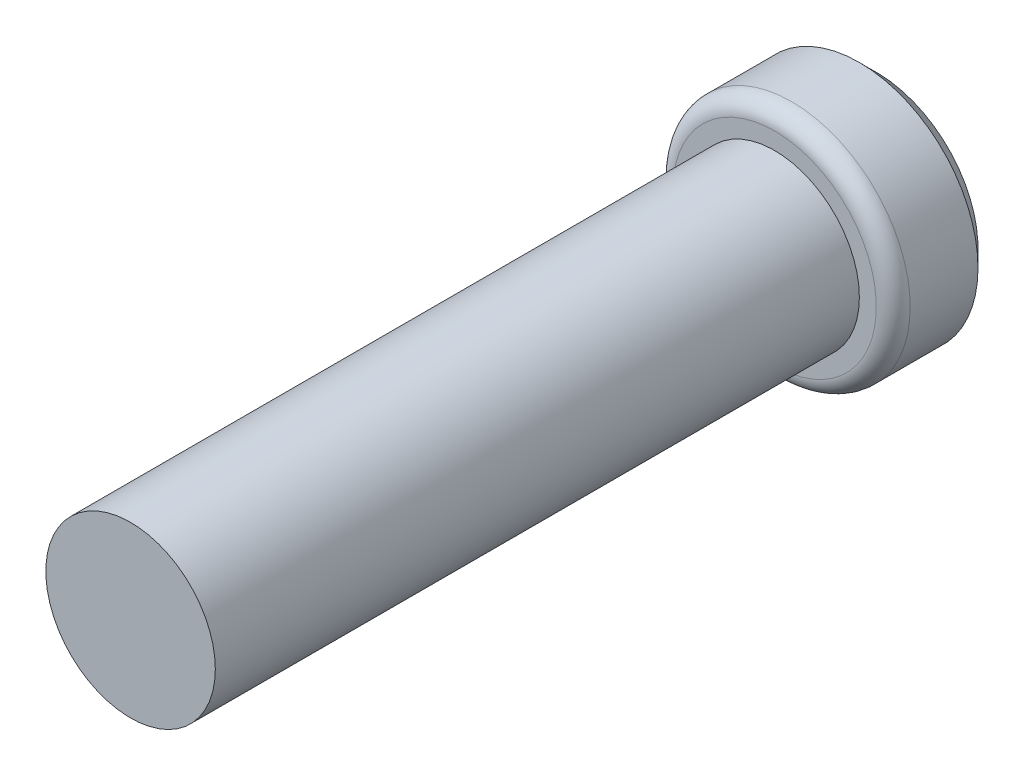
ISO-10303-21;
HEADER;
FILE_DESCRIPTION(('STEP AP214'),'2;1');
FILE_NAME('part.step','',(''),(''),'','','');
FILE_SCHEMA(('AUTOMOTIVE_DESIGN { 1 0 10303 214 1 1 1 1 }'));
ENDSEC;
DATA;
#1=APPLICATION_CONTEXT('core data for automotive mechanical design processes');
#2=APPLICATION_PROTOCOL_DEFINITION('international standard','automotive_design',2000,#1);
#3=PRODUCT_CONTEXT('',#1,'mechanical');
#4=PRODUCT('Part','Part','',(#3));
#5=PRODUCT_RELATED_PRODUCT_CATEGORY('part','',(#4));
#6=PRODUCT_DEFINITION_FORMATION('','',#4);
#7=PRODUCT_DEFINITION_CONTEXT('part definition',#1,'design');
#8=PRODUCT_DEFINITION('design','',#6,#7);
#9=PRODUCT_DEFINITION_SHAPE('','',#8);
#10=(LENGTH_UNIT() NAMED_UNIT(*) SI_UNIT(.MILLI.,.METRE.));
#11=(NAMED_UNIT(*) PLANE_ANGLE_UNIT() SI_UNIT($,.RADIAN.));
#12=(NAMED_UNIT(*) SI_UNIT($,.STERADIAN.) SOLID_ANGLE_UNIT());
#13=UNCERTAINTY_MEASURE_WITH_UNIT(LENGTH_MEASURE(1.E-05),#10,'distance_accuracy_value','');
#14=(GEOMETRIC_REPRESENTATION_CONTEXT(3) GLOBAL_UNCERTAINTY_ASSIGNED_CONTEXT((#13)) GLOBAL_UNIT_ASSIGNED_CONTEXT((#10,
#11,#12)) REPRESENTATION_CONTEXT('',''));
#15=CARTESIAN_POINT('',(0.,0.,0.));
#16=DIRECTION('',(0.,0.,1.));
#17=DIRECTION('',(1.,0.,0.));
#18=AXIS2_PLACEMENT_3D('',#15,#16,#17);
#19=CARTESIAN_POINT('',(0.,0.,19.));
#20=DIRECTION('',(0.,0.,-1.));
#21=DIRECTION('',(-1.,0.,0.));
#22=AXIS2_PLACEMENT_3D('',#19,#20,#21);
#23=CYLINDRICAL_SURFACE('',#22,2.5);
#24=CARTESIAN_POINT('',(0.,0.,19.));
#25=DIRECTION('',(0.,0.,1.));
#26=DIRECTION('',(1.,0.,0.));
#27=AXIS2_PLACEMENT_3D('',#24,#25,#26);
#28=CIRCLE('',#27,2.5);
#29=CARTESIAN_POINT('',(2.5,0.,19.));
#30=VERTEX_POINT('',#29);
#31=EDGE_CURVE('E144',#30,#30,#28,.T.);
#32=ORIENTED_EDGE('',*,*,#31,.F.);
#33=EDGE_LOOP('',(#32));
#34=FACE_BOUND('',#33,.T.);
#35=CARTESIAN_POINT('',(0.,0.,0.));
#36=DIRECTION('',(0.,0.,1.));
#37=DIRECTION('',(1.,0.,0.));
#38=AXIS2_PLACEMENT_3D('',#35,#36,#37);
#39=CIRCLE('',#38,2.5);
#40=CARTESIAN_POINT('',(2.5,0.,0.));
#41=VERTEX_POINT('',#40);
#42=EDGE_CURVE('E138',#41,#41,#39,.T.);
#43=ORIENTED_EDGE('',*,*,#42,.T.);
#44=EDGE_LOOP('',(#43));
#45=FACE_BOUND('',#44,.T.);
#46=ADVANCED_FACE('F36',(#34,#45),#23,.T.);
#47=CARTESIAN_POINT('',(0.,0.,19.));
#48=DIRECTION('',(0.,0.,1.));
#49=DIRECTION('',(1.,0.,0.));
#50=AXIS2_PLACEMENT_3D('',#47,#48,#49);
#51=PLANE('',#50);
#52=ORIENTED_EDGE('',*,*,#31,.T.);
#53=EDGE_LOOP('',(#52));
#54=FACE_BOUND('',#53,.T.);
#55=ADVANCED_FACE('F169',(#54),#51,.T.);
#56=CARTESIAN_POINT('',(0.,0.,-3.));
#57=DIRECTION('',(0.,0.,1.));
#58=DIRECTION('',(1.,0.,0.));
#59=AXIS2_PLACEMENT_3D('',#56,#57,#58);
#60=CYLINDRICAL_SURFACE('',#59,3.5);
#61=CARTESIAN_POINT('',(0.,0.,-0.5));
#62=DIRECTION('',(0.,0.,-1.));
#63=DIRECTION('',(-1.,0.,0.));
#64=AXIS2_PLACEMENT_3D('',#61,#62,#63);
#65=CIRCLE('',#64,3.5);
#66=CARTESIAN_POINT('',(-3.5,0.,-0.5));
#67=VERTEX_POINT('',#66);
#68=EDGE_CURVE('E44',#67,#67,#65,.T.);
#69=ORIENTED_EDGE('',*,*,#68,.T.);
#70=EDGE_LOOP('',(#69));
#71=FACE_BOUND('',#70,.T.);
#72=CARTESIAN_POINT('',(0.,0.,-2.5));
#73=DIRECTION('',(0.,0.,-1.));
#74=DIRECTION('',(-1.,0.,0.));
#75=AXIS2_PLACEMENT_3D('',#72,#73,#74);
#76=CIRCLE('',#75,3.5);
#77=CARTESIAN_POINT('',(-3.5,0.,-2.5));
#78=VERTEX_POINT('',#77);
#79=EDGE_CURVE('E152',#78,#78,#76,.F.);
#80=ORIENTED_EDGE('',*,*,#79,.T.);
#81=EDGE_LOOP('',(#80));
#82=FACE_BOUND('',#81,.T.);
#83=ADVANCED_FACE('F157',(#71,#82),#60,.T.);
#84=CARTESIAN_POINT('',(0.,0.,-3.));
#85=DIRECTION('',(0.,0.,-1.));
#86=DIRECTION('',(-1.,0.,0.));
#87=AXIS2_PLACEMENT_3D('',#84,#85,#86);
#88=PLANE('',#87);
#89=CARTESIAN_POINT('',(0.,0.,-3.));
#90=DIRECTION('',(0.,0.,-1.));
#91=DIRECTION('',(-1.,0.,0.));
#92=AXIS2_PLACEMENT_3D('',#89,#90,#91);
#93=CIRCLE('',#92,3.);
#94=CARTESIAN_POINT('',(-3.,0.,-3.));
#95=VERTEX_POINT('',#94);
#96=EDGE_CURVE('E147',#95,#95,#93,.T.);
#97=ORIENTED_EDGE('',*,*,#96,.T.);
#98=EDGE_LOOP('',(#97));
#99=FACE_BOUND('',#98,.T.);
#100=DIRECTION('',(-0.866025403784436,0.500000000000004,0.));
#101=VECTOR('',#100,1.);
#102=CARTESIAN_POINT('',(-1.09002923180361,-1.8879860112191,-3.));
#103=LINE('',#102,#101);
#104=CARTESIAN_POINT('',(0.,-2.51731468162548,-3.));
#105=VERTEX_POINT('',#104);
#106=CARTESIAN_POINT('',(-2.18005846360722,-1.25865734081272,-3.));
#107=VERTEX_POINT('',#106);
#108=EDGE_CURVE('E51',#105,#107,#103,.T.);
#109=ORIENTED_EDGE('',*,*,#108,.F.);
#110=DIRECTION('',(-0.86602540378444,-0.499999999999998,0.));
#111=VECTOR('',#110,1.);
#112=CARTESIAN_POINT('',(1.0900292318036,-1.88798601121912,-3.));
#113=LINE('',#112,#111);
#114=CARTESIAN_POINT('',(2.1800584636072,-1.25865734081275,-3.));
#115=VERTEX_POINT('',#114);
#116=EDGE_CURVE('E134',#115,#105,#113,.T.);
#117=ORIENTED_EDGE('',*,*,#116,.F.);
#118=DIRECTION('',(0.,-1.,0.));
#119=VECTOR('',#118,1.);
#120=CARTESIAN_POINT('',(2.1800584636072,0.,-3.));
#121=LINE('',#120,#119);
#122=CARTESIAN_POINT('',(2.18005846360721,1.25865734081274,-3.));
#123=VERTEX_POINT('',#122);
#124=EDGE_CURVE('E132',#123,#115,#121,.T.);
#125=ORIENTED_EDGE('',*,*,#124,.F.);
#126=DIRECTION('',(0.866025403784438,-0.500000000000001,0.));
#127=VECTOR('',#126,1.);
#128=CARTESIAN_POINT('',(1.0900292318036,1.88798601121911,-3.));
#129=LINE('',#128,#127);
#130=CARTESIAN_POINT('',(0.,2.51731468162548,-3.));
#131=VERTEX_POINT('',#130);
#132=EDGE_CURVE('E99',#131,#123,#129,.T.);
#133=ORIENTED_EDGE('',*,*,#132,.F.);
#134=DIRECTION('',(0.866025403784441,0.499999999999995,0.));
#135=VECTOR('',#134,1.);
#136=CARTESIAN_POINT('',(-1.0900292318036,1.88798601121912,-3.));
#137=LINE('',#136,#135);
#138=CARTESIAN_POINT('',(-2.18005846360719,1.25865734081277,-3.));
#139=VERTEX_POINT('',#138);
#140=EDGE_CURVE('E128',#139,#131,#137,.T.);
#141=ORIENTED_EDGE('',*,*,#140,.F.);
#142=DIRECTION('',(0.,1.,0.));
#143=VECTOR('',#142,1.);
#144=CARTESIAN_POINT('',(-2.1800584636072,0.,-3.));
#145=LINE('',#144,#143);
#146=EDGE_CURVE('E125',#107,#139,#145,.T.);
#147=ORIENTED_EDGE('',*,*,#146,.F.);
#148=EDGE_LOOP('',(#109,#117,#125,#133,#141,#147));
#149=FACE_BOUND('',#148,.T.);
#150=ADVANCED_FACE('F185',(#99,#149),#88,.T.);
#151=CARTESIAN_POINT('',(0.,0.,0.));
#152=DIRECTION('',(0.,0.,-1.));
#153=DIRECTION('',(-1.,0.,0.));
#154=AXIS2_PLACEMENT_3D('',#151,#152,#153);
#155=PLANE('',#154);
#156=CARTESIAN_POINT('',(0.,0.,0.));
#157=DIRECTION('',(0.,0.,-1.));
#158=DIRECTION('',(-1.,0.,0.));
#159=AXIS2_PLACEMENT_3D('',#156,#157,#158);
#160=CIRCLE('',#159,3.);
#161=CARTESIAN_POINT('',(-3.,0.,0.));
#162=VERTEX_POINT('',#161);
#163=EDGE_CURVE('E11',#162,#162,#160,.F.);
#164=ORIENTED_EDGE('',*,*,#163,.T.);
#165=EDGE_LOOP('',(#164));
#166=FACE_BOUND('',#165,.T.);
#167=ORIENTED_EDGE('',*,*,#42,.F.);
#168=EDGE_LOOP('',(#167));
#169=FACE_BOUND('',#168,.T.);
#170=ADVANCED_FACE('F186',(#166,#169),#155,.F.);
#171=CARTESIAN_POINT('',(-1.09002923180361,-1.8879860112191,-1.));
#172=DIRECTION('',(-0.500000000000004,-0.866025403784436,0.));
#173=DIRECTION('',(0.866025403784436,-0.500000000000004,0.));
#174=AXIS2_PLACEMENT_3D('',#171,#172,#173);
#175=PLANE('',#174);
#176=ORIENTED_EDGE('',*,*,#108,.T.);
#177=DIRECTION('',(0.,0.,-1.));
#178=VECTOR('',#177,1.);
#179=CARTESIAN_POINT('',(-2.18005846360722,-1.25865734081272,-1.));
#180=LINE('',#179,#178);
#181=CARTESIAN_POINT('',(-2.18005846360722,-1.25865734081272,-1.));
#182=VERTEX_POINT('',#181);
#183=EDGE_CURVE('E81',#182,#107,#180,.T.);
#184=ORIENTED_EDGE('',*,*,#183,.F.);
#185=DIRECTION('',(-0.866025403784436,0.500000000000004,0.));
#186=VECTOR('',#185,1.);
#187=CARTESIAN_POINT('',(-1.09002923180361,-1.8879860112191,-1.));
#188=LINE('',#187,#186);
#189=CARTESIAN_POINT('',(0.,-2.51731468162548,-1.));
#190=VERTEX_POINT('',#189);
#191=EDGE_CURVE('E136',#190,#182,#188,.T.);
#192=ORIENTED_EDGE('',*,*,#191,.F.);
#193=DIRECTION('',(0.,0.,-1.));
#194=VECTOR('',#193,1.);
#195=CARTESIAN_POINT('',(0.,-2.51731468162548,-1.));
#196=LINE('',#195,#194);
#197=EDGE_CURVE('E59',#190,#105,#196,.T.);
#198=ORIENTED_EDGE('',*,*,#197,.T.);
#199=EDGE_LOOP('',(#176,#184,#192,#198));
#200=FACE_BOUND('',#199,.T.);
#201=ADVANCED_FACE('F189',(#200),#175,.F.);
#202=CARTESIAN_POINT('',(1.0900292318036,-1.88798601121912,-1.));
#203=DIRECTION('',(0.499999999999998,-0.86602540378444,0.));
#204=DIRECTION('',(0.86602540378444,0.499999999999998,0.));
#205=AXIS2_PLACEMENT_3D('',#202,#203,#204);
#206=PLANE('',#205);
#207=ORIENTED_EDGE('',*,*,#116,.T.);
#208=ORIENTED_EDGE('',*,*,#197,.F.);
#209=DIRECTION('',(-0.86602540378444,-0.499999999999998,0.));
#210=VECTOR('',#209,1.);
#211=CARTESIAN_POINT('',(1.0900292318036,-1.88798601121912,-1.));
#212=LINE('',#211,#210);
#213=CARTESIAN_POINT('',(2.1800584636072,-1.25865734081275,-1.));
#214=VERTEX_POINT('',#213);
#215=EDGE_CURVE('E111',#214,#190,#212,.T.);
#216=ORIENTED_EDGE('',*,*,#215,.F.);
#217=DIRECTION('',(0.,0.,-1.));
#218=VECTOR('',#217,1.);
#219=CARTESIAN_POINT('',(2.1800584636072,-1.25865734081275,-1.));
#220=LINE('',#219,#218);
#221=EDGE_CURVE('E103',#214,#115,#220,.T.);
#222=ORIENTED_EDGE('',*,*,#221,.T.);
#223=EDGE_LOOP('',(#207,#208,#216,#222));
#224=FACE_BOUND('',#223,.T.);
#225=ADVANCED_FACE('F196',(#224),#206,.F.);
#226=CARTESIAN_POINT('',(2.1800584636072,0.,-1.));
#227=DIRECTION('',(1.,0.,0.));
#228=DIRECTION('',(0.,1.,0.));
#229=AXIS2_PLACEMENT_3D('',#226,#227,#228);
#230=PLANE('',#229);
#231=ORIENTED_EDGE('',*,*,#124,.T.);
#232=ORIENTED_EDGE('',*,*,#221,.F.);
#233=DIRECTION('',(0.,-1.,0.));
#234=VECTOR('',#233,1.);
#235=CARTESIAN_POINT('',(2.1800584636072,0.,-1.));
#236=LINE('',#235,#234);
#237=CARTESIAN_POINT('',(2.18005846360721,1.25865734081274,-1.));
#238=VERTEX_POINT('',#237);
#239=EDGE_CURVE('E107',#238,#214,#236,.T.);
#240=ORIENTED_EDGE('',*,*,#239,.F.);
#241=DIRECTION('',(0.,0.,-1.));
#242=VECTOR('',#241,1.);
#243=CARTESIAN_POINT('',(2.18005846360721,1.25865734081274,-1.));
#244=LINE('',#243,#242);
#245=EDGE_CURVE('E92',#238,#123,#244,.T.);
#246=ORIENTED_EDGE('',*,*,#245,.T.);
#247=EDGE_LOOP('',(#231,#232,#240,#246));
#248=FACE_BOUND('',#247,.T.);
#249=ADVANCED_FACE('F108',(#248),#230,.F.);
#250=CARTESIAN_POINT('',(1.0900292318036,1.88798601121911,-1.));
#251=DIRECTION('',(0.500000000000001,0.866025403784438,0.));
#252=DIRECTION('',(-0.866025403784438,0.500000000000001,0.));
#253=AXIS2_PLACEMENT_3D('',#250,#251,#252);
#254=PLANE('',#253);
#255=ORIENTED_EDGE('',*,*,#132,.T.);
#256=ORIENTED_EDGE('',*,*,#245,.F.);
#257=DIRECTION('',(0.866025403784438,-0.500000000000001,0.));
#258=VECTOR('',#257,1.);
#259=CARTESIAN_POINT('',(1.0900292318036,1.88798601121911,-1.));
#260=LINE('',#259,#258);
#261=CARTESIAN_POINT('',(0.,2.51731468162548,-1.));
#262=VERTEX_POINT('',#261);
#263=EDGE_CURVE('E96',#262,#238,#260,.T.);
#264=ORIENTED_EDGE('',*,*,#263,.F.);
#265=DIRECTION('',(0.,0.,-1.));
#266=VECTOR('',#265,1.);
#267=CARTESIAN_POINT('',(0.,2.51731468162548,-1.));
#268=LINE('',#267,#266);
#269=EDGE_CURVE('E104',#262,#131,#268,.T.);
#270=ORIENTED_EDGE('',*,*,#269,.T.);
#271=EDGE_LOOP('',(#255,#256,#264,#270));
#272=FACE_BOUND('',#271,.T.);
#273=ADVANCED_FACE('F94',(#272),#254,.F.);
#274=CARTESIAN_POINT('',(-1.0900292318036,1.88798601121912,-1.));
#275=DIRECTION('',(-0.499999999999995,0.866025403784441,0.));
#276=DIRECTION('',(-0.866025403784442,-0.499999999999995,0.));
#277=AXIS2_PLACEMENT_3D('',#274,#275,#276);
#278=PLANE('',#277);
#279=ORIENTED_EDGE('',*,*,#140,.T.);
#280=ORIENTED_EDGE('',*,*,#269,.F.);
#281=DIRECTION('',(0.866025403784441,0.499999999999995,0.));
#282=VECTOR('',#281,1.);
#283=CARTESIAN_POINT('',(-1.0900292318036,1.88798601121912,-1.));
#284=LINE('',#283,#282);
#285=CARTESIAN_POINT('',(-2.18005846360719,1.25865734081277,-1.));
#286=VERTEX_POINT('',#285);
#287=EDGE_CURVE('E117',#286,#262,#284,.T.);
#288=ORIENTED_EDGE('',*,*,#287,.F.);
#289=DIRECTION('',(0.,0.,-1.));
#290=VECTOR('',#289,1.);
#291=CARTESIAN_POINT('',(-2.18005846360719,1.25865734081277,-1.));
#292=LINE('',#291,#290);
#293=EDGE_CURVE('E141',#286,#139,#292,.T.);
#294=ORIENTED_EDGE('',*,*,#293,.T.);
#295=EDGE_LOOP('',(#279,#280,#288,#294));
#296=FACE_BOUND('',#295,.T.);
#297=ADVANCED_FACE('F200',(#296),#278,.F.);
#298=CARTESIAN_POINT('',(-2.1800584636072,0.,-1.));
#299=DIRECTION('',(-1.,0.,0.));
#300=DIRECTION('',(0.,-1.,0.));
#301=AXIS2_PLACEMENT_3D('',#298,#299,#300);
#302=PLANE('',#301);
#303=ORIENTED_EDGE('',*,*,#146,.T.);
#304=ORIENTED_EDGE('',*,*,#293,.F.);
#305=DIRECTION('',(0.,1.,0.));
#306=VECTOR('',#305,1.);
#307=CARTESIAN_POINT('',(-2.1800584636072,0.,-1.));
#308=LINE('',#307,#306);
#309=EDGE_CURVE('E119',#182,#286,#308,.T.);
#310=ORIENTED_EDGE('',*,*,#309,.F.);
#311=ORIENTED_EDGE('',*,*,#183,.T.);
#312=EDGE_LOOP('',(#303,#304,#310,#311));
#313=FACE_BOUND('',#312,.T.);
#314=ADVANCED_FACE('F197',(#313),#302,.F.);
#315=CARTESIAN_POINT('',(0.,0.,-1.));
#316=DIRECTION('',(0.,0.,-1.));
#317=DIRECTION('',(-1.,0.,0.));
#318=AXIS2_PLACEMENT_3D('',#315,#316,#317);
#319=PLANE('',#318);
#320=ORIENTED_EDGE('',*,*,#191,.T.);
#321=ORIENTED_EDGE('',*,*,#309,.T.);
#322=ORIENTED_EDGE('',*,*,#287,.T.);
#323=ORIENTED_EDGE('',*,*,#263,.T.);
#324=ORIENTED_EDGE('',*,*,#239,.T.);
#325=ORIENTED_EDGE('',*,*,#215,.T.);
#326=EDGE_LOOP('',(#320,#321,#322,#323,#324,#325));
#327=FACE_BOUND('',#326,.T.);
#328=ADVANCED_FACE('F114',(#327),#319,.T.);
#329=CARTESIAN_POINT('',(0.,0.,-3.));
#330=DIRECTION('',(0.,0.,1.));
#331=DIRECTION('',(1.,0.,0.));
#332=AXIS2_PLACEMENT_3D('',#329,#330,#331);
#333=CONICAL_SURFACE('',#332,3.,0.785398163397447);
#334=ORIENTED_EDGE('',*,*,#79,.F.);
#335=EDGE_LOOP('',(#334));
#336=FACE_BOUND('',#335,.T.);
#337=ORIENTED_EDGE('',*,*,#96,.F.);
#338=EDGE_LOOP('',(#337));
#339=FACE_BOUND('',#338,.T.);
#340=ADVANCED_FACE('F161',(#336,#339),#333,.T.);
#341=CARTESIAN_POINT('',(0.,0.,-0.5));
#342=DIRECTION('',(0.,0.,-1.));
#343=DIRECTION('',(-1.,0.,0.));
#344=AXIS2_PLACEMENT_3D('',#341,#342,#343);
#345=TOROIDAL_SURFACE('',#344,3.,0.5);
#346=ORIENTED_EDGE('',*,*,#163,.F.);
#347=EDGE_LOOP('',(#346));
#348=FACE_BOUND('',#347,.T.);
#349=ORIENTED_EDGE('',*,*,#68,.F.);
#350=EDGE_LOOP('',(#349));
#351=FACE_BOUND('',#350,.T.);
#352=ADVANCED_FACE('F38',(#348,#351),#345,.T.);
#353=CLOSED_SHELL('',(#46,#55,#83,#150,#170,#201,#225,#249,#273,#297,#314,#328,#340,#352));
#354=MANIFOLD_SOLID_BREP('B2',#353);
#355=ADVANCED_BREP_SHAPE_REPRESENTATION('',(#18,#354),#14);
#356=SHAPE_DEFINITION_REPRESENTATION(#9,#355);
ENDSEC;
END-ISO-10303-21;
